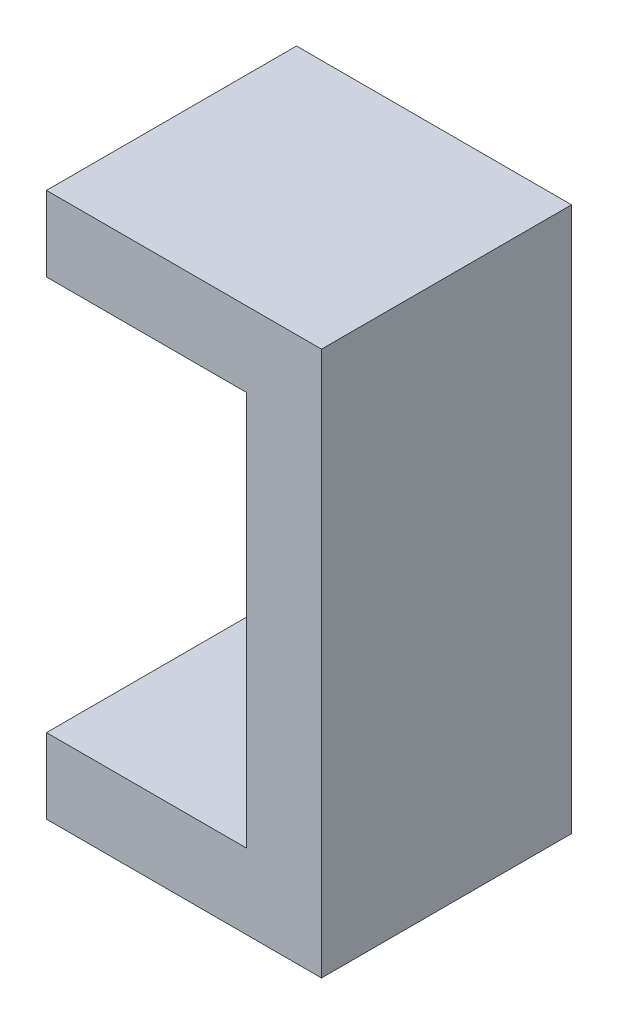
ISO-10303-21;
HEADER;
FILE_DESCRIPTION(('STEP AP214'),'2;1');
FILE_NAME('part.step','',(''),(''),'','','');
FILE_SCHEMA(('AUTOMOTIVE_DESIGN { 1 0 10303 214 1 1 1 1 }'));
ENDSEC;
DATA;
#1=APPLICATION_CONTEXT('core data for automotive mechanical design processes');
#2=APPLICATION_PROTOCOL_DEFINITION('international standard','automotive_design',2000,#1);
#3=PRODUCT_CONTEXT('',#1,'mechanical');
#4=PRODUCT('Part','Part','',(#3));
#5=PRODUCT_RELATED_PRODUCT_CATEGORY('part','',(#4));
#6=PRODUCT_DEFINITION_FORMATION('','',#4);
#7=PRODUCT_DEFINITION_CONTEXT('part definition',#1,'design');
#8=PRODUCT_DEFINITION('design','',#6,#7);
#9=PRODUCT_DEFINITION_SHAPE('','',#8);
#10=(LENGTH_UNIT() NAMED_UNIT(*) SI_UNIT(.MILLI.,.METRE.));
#11=(NAMED_UNIT(*) PLANE_ANGLE_UNIT() SI_UNIT($,.RADIAN.));
#12=(NAMED_UNIT(*) SI_UNIT($,.STERADIAN.) SOLID_ANGLE_UNIT());
#13=UNCERTAINTY_MEASURE_WITH_UNIT(LENGTH_MEASURE(1.E-05),#10,'distance_accuracy_value','');
#14=(GEOMETRIC_REPRESENTATION_CONTEXT(3) GLOBAL_UNCERTAINTY_ASSIGNED_CONTEXT((#13)) GLOBAL_UNIT_ASSIGNED_CONTEXT((#10,
#11,#12)) REPRESENTATION_CONTEXT('',''));
#15=CARTESIAN_POINT('',(0.,0.,0.));
#16=DIRECTION('',(0.,0.,1.));
#17=DIRECTION('',(1.,0.,0.));
#18=AXIS2_PLACEMENT_3D('',#15,#16,#17);
#19=CARTESIAN_POINT('',(-13.6553514130531,2.508,-13.4290792225759));
#20=DIRECTION('',(0.,1.,0.));
#21=DIRECTION('',(0.,0.,1.));
#22=AXIS2_PLACEMENT_3D('',#19,#20,#21);
#23=PLANE('',#22);
#24=DIRECTION('',(0.,0.,1.));
#25=VECTOR('',#24,1.);
#26=CARTESIAN_POINT('',(0.,2.508,-3.26907922257588));
#27=LINE('',#26,#25);
#28=CARTESIAN_POINT('',(0.,2.508,-13.4290792225759));
#29=VERTEX_POINT('',#28);
#30=CARTESIAN_POINT('',(0.,2.508,-3.26907922257588));
#31=VERTEX_POINT('',#30);
#32=EDGE_CURVE('E50',#29,#31,#27,.T.);
#33=ORIENTED_EDGE('',*,*,#32,.F.);
#34=DIRECTION('',(1.,0.,0.));
#35=VECTOR('',#34,1.);
#36=CARTESIAN_POINT('',(-13.6553514130531,2.508,-13.4290792225759));
#37=LINE('',#36,#35);
#38=CARTESIAN_POINT('',(5.08,2.508,-13.4290792225759));
#39=VERTEX_POINT('',#38);
#40=EDGE_CURVE('E123',#29,#39,#37,.T.);
#41=ORIENTED_EDGE('',*,*,#40,.T.);
#42=DIRECTION('',(0.,0.,1.));
#43=VECTOR('',#42,1.);
#44=CARTESIAN_POINT('',(5.08,2.508,-13.4290792225759));
#45=LINE('',#44,#43);
#46=CARTESIAN_POINT('',(5.08,2.508,-3.26907922257588));
#47=VERTEX_POINT('',#46);
#48=EDGE_CURVE('E147',#39,#47,#45,.T.);
#49=ORIENTED_EDGE('',*,*,#48,.T.);
#50=DIRECTION('',(1.,0.,0.));
#51=VECTOR('',#50,1.);
#52=CARTESIAN_POINT('',(-13.6553514130531,2.508,-3.26907922257588));
#53=LINE('',#52,#51);
#54=EDGE_CURVE('E55',#31,#47,#53,.T.);
#55=ORIENTED_EDGE('',*,*,#54,.F.);
#56=EDGE_LOOP('',(#33,#41,#49,#55));
#57=FACE_BOUND('',#56,.T.);
#58=ADVANCED_FACE('F35',(#57),#23,.F.);
#59=CARTESIAN_POINT('',(5.08,19.7193514130531,-3.26907922257588));
#60=DIRECTION('',(1.,0.,0.));
#61=DIRECTION('',(0.,0.,-1.));
#62=AXIS2_PLACEMENT_3D('',#59,#60,#61);
#63=PLANE('',#62);
#64=ORIENTED_EDGE('',*,*,#48,.F.);
#65=DIRECTION('',(0.,-1.,0.));
#66=VECTOR('',#65,1.);
#67=CARTESIAN_POINT('',(5.08,19.7193514130531,-13.4290792225759));
#68=LINE('',#67,#66);
#69=CARTESIAN_POINT('',(5.08,-13.5255,-13.4290792225759));
#70=VERTEX_POINT('',#69);
#71=EDGE_CURVE('E138',#39,#70,#68,.T.);
#72=ORIENTED_EDGE('',*,*,#71,.T.);
#73=DIRECTION('',(0.,0.,1.));
#74=VECTOR('',#73,1.);
#75=CARTESIAN_POINT('',(5.08,-13.5255,-3.26907922257588));
#76=LINE('',#75,#74);
#77=CARTESIAN_POINT('',(5.08,-13.5255,-3.26907922257588));
#78=VERTEX_POINT('',#77);
#79=EDGE_CURVE('E163',#70,#78,#76,.T.);
#80=ORIENTED_EDGE('',*,*,#79,.T.);
#81=DIRECTION('',(0.,-1.,0.));
#82=VECTOR('',#81,1.);
#83=CARTESIAN_POINT('',(5.08,19.7193514130531,-3.26907922257588));
#84=LINE('',#83,#82);
#85=EDGE_CURVE('E166',#47,#78,#84,.T.);
#86=ORIENTED_EDGE('',*,*,#85,.F.);
#87=EDGE_LOOP('',(#64,#72,#80,#86));
#88=FACE_BOUND('',#87,.T.);
#89=ADVANCED_FACE('F231',(#88),#63,.F.);
#90=CARTESIAN_POINT('',(8.128,-16.5735,-3.26907922257588));
#91=DIRECTION('',(-1.,0.,0.));
#92=DIRECTION('',(0.,0.,1.));
#93=AXIS2_PLACEMENT_3D('',#90,#91,#92);
#94=PLANE('',#93);
#95=DIRECTION('',(0.,1.,0.));
#96=VECTOR('',#95,1.);
#97=CARTESIAN_POINT('',(8.128,-16.5735,-13.4290792225759));
#98=LINE('',#97,#96);
#99=CARTESIAN_POINT('',(8.128,-16.5735,-13.4290792225759));
#100=VERTEX_POINT('',#99);
#101=CARTESIAN_POINT('',(8.128,5.556,-13.4290792225759));
#102=VERTEX_POINT('',#101);
#103=EDGE_CURVE('E188',#100,#102,#98,.T.);
#104=ORIENTED_EDGE('',*,*,#103,.T.);
#105=DIRECTION('',(0.,0.,-1.));
#106=VECTOR('',#105,1.);
#107=CARTESIAN_POINT('',(8.128,5.556,-3.26907922257588));
#108=LINE('',#107,#106);
#109=CARTESIAN_POINT('',(8.128,5.556,-3.26907922257588));
#110=VERTEX_POINT('',#109);
#111=EDGE_CURVE('E170',#110,#102,#108,.T.);
#112=ORIENTED_EDGE('',*,*,#111,.F.);
#113=DIRECTION('',(0.,1.,0.));
#114=VECTOR('',#113,1.);
#115=CARTESIAN_POINT('',(8.128,-16.5735,-3.26907922257588));
#116=LINE('',#115,#114);
#117=CARTESIAN_POINT('',(8.128,-16.5735,-3.26907922257588));
#118=VERTEX_POINT('',#117);
#119=EDGE_CURVE('E11',#118,#110,#116,.T.);
#120=ORIENTED_EDGE('',*,*,#119,.F.);
#121=DIRECTION('',(0.,0.,1.));
#122=VECTOR('',#121,1.);
#123=CARTESIAN_POINT('',(8.128,-16.5735,-3.26907922257588));
#124=LINE('',#123,#122);
#125=EDGE_CURVE('E178',#100,#118,#124,.T.);
#126=ORIENTED_EDGE('',*,*,#125,.F.);
#127=EDGE_LOOP('',(#104,#112,#120,#126));
#128=FACE_BOUND('',#127,.T.);
#129=ADVANCED_FACE('F37',(#128),#94,.F.);
#130=CARTESIAN_POINT('',(8.128,-16.5735,-3.26907922257588));
#131=DIRECTION('',(0.,0.,-1.));
#132=DIRECTION('',(-1.,0.,0.));
#133=AXIS2_PLACEMENT_3D('',#130,#131,#132);
#134=PLANE('',#133);
#135=ORIENTED_EDGE('',*,*,#119,.T.);
#136=DIRECTION('',(1.,0.,0.));
#137=VECTOR('',#136,1.);
#138=CARTESIAN_POINT('',(8.128,5.556,-3.26907922257588));
#139=LINE('',#138,#137);
#140=CARTESIAN_POINT('',(-3.048,5.556,-3.26907922257588));
#141=VERTEX_POINT('',#140);
#142=EDGE_CURVE('E173',#141,#110,#139,.T.);
#143=ORIENTED_EDGE('',*,*,#142,.F.);
#144=DIRECTION('',(0.,-1.,0.));
#145=VECTOR('',#144,1.);
#146=CARTESIAN_POINT('',(-3.048,5.556,-3.26907922257588));
#147=LINE('',#146,#145);
#148=CARTESIAN_POINT('',(-3.048,2.508,-3.26907922257588));
#149=VERTEX_POINT('',#148);
#150=EDGE_CURVE('E154',#141,#149,#147,.T.);
#151=ORIENTED_EDGE('',*,*,#150,.T.);
#152=EDGE_CURVE('E160',#149,#31,#53,.T.);
#153=ORIENTED_EDGE('',*,*,#152,.T.);
#154=ORIENTED_EDGE('',*,*,#54,.T.);
#155=ORIENTED_EDGE('',*,*,#85,.T.);
#156=DIRECTION('',(-1.,0.,0.));
#157=VECTOR('',#156,1.);
#158=CARTESIAN_POINT('',(8.128,-13.5255,-3.26907922257588));
#159=LINE('',#158,#157);
#160=CARTESIAN_POINT('',(-3.048,-13.5255,-3.26907922257588));
#161=VERTEX_POINT('',#160);
#162=EDGE_CURVE('E169',#78,#161,#159,.T.);
#163=ORIENTED_EDGE('',*,*,#162,.T.);
#164=DIRECTION('',(0.,1.,0.));
#165=VECTOR('',#164,1.);
#166=CARTESIAN_POINT('',(-3.048,-16.5735,-3.26907922257588));
#167=LINE('',#166,#165);
#168=CARTESIAN_POINT('',(-3.048,-16.5735,-3.26907922257588));
#169=VERTEX_POINT('',#168);
#170=EDGE_CURVE('E43',#169,#161,#167,.T.);
#171=ORIENTED_EDGE('',*,*,#170,.F.);
#172=DIRECTION('',(-1.,0.,0.));
#173=VECTOR('',#172,1.);
#174=CARTESIAN_POINT('',(8.128,-16.5735,-3.26907922257588));
#175=LINE('',#174,#173);
#176=EDGE_CURVE('E181',#118,#169,#175,.T.);
#177=ORIENTED_EDGE('',*,*,#176,.F.);
#178=EDGE_LOOP('',(#135,#143,#151,#153,#154,#155,#163,#171,#177));
#179=FACE_BOUND('',#178,.T.);
#180=ADVANCED_FACE('F215',(#179),#134,.F.);
#181=CARTESIAN_POINT('',(-3.048,-16.5735,-3.26907922257588));
#182=DIRECTION('',(1.,0.,0.));
#183=DIRECTION('',(0.,0.,-1.));
#184=AXIS2_PLACEMENT_3D('',#181,#182,#183);
#185=PLANE('',#184);
#186=DIRECTION('',(0.,0.,-1.));
#187=VECTOR('',#186,1.);
#188=CARTESIAN_POINT('',(-3.048,-13.5255,-3.26907922257588));
#189=LINE('',#188,#187);
#190=CARTESIAN_POINT('',(-3.048,-13.5255,-13.4290792225759));
#191=VERTEX_POINT('',#190);
#192=EDGE_CURVE('E190',#161,#191,#189,.T.);
#193=ORIENTED_EDGE('',*,*,#192,.T.);
#194=DIRECTION('',(0.,1.,0.));
#195=VECTOR('',#194,1.);
#196=CARTESIAN_POINT('',(-3.048,-16.5735,-13.4290792225759));
#197=LINE('',#196,#195);
#198=CARTESIAN_POINT('',(-3.048,-16.5735,-13.4290792225759));
#199=VERTEX_POINT('',#198);
#200=EDGE_CURVE('E194',#199,#191,#197,.T.);
#201=ORIENTED_EDGE('',*,*,#200,.F.);
#202=DIRECTION('',(0.,0.,-1.));
#203=VECTOR('',#202,1.);
#204=CARTESIAN_POINT('',(-3.048,-16.5735,-3.26907922257588));
#205=LINE('',#204,#203);
#206=EDGE_CURVE('E184',#169,#199,#205,.T.);
#207=ORIENTED_EDGE('',*,*,#206,.F.);
#208=ORIENTED_EDGE('',*,*,#170,.T.);
#209=EDGE_LOOP('',(#193,#201,#207,#208));
#210=FACE_BOUND('',#209,.T.);
#211=ADVANCED_FACE('F201',(#210),#185,.F.);
#212=CARTESIAN_POINT('',(8.128,-16.5735,-13.4290792225759));
#213=DIRECTION('',(0.,0.,1.));
#214=DIRECTION('',(1.,0.,0.));
#215=AXIS2_PLACEMENT_3D('',#212,#213,#214);
#216=PLANE('',#215);
#217=DIRECTION('',(1.,0.,0.));
#218=VECTOR('',#217,1.);
#219=CARTESIAN_POINT('',(8.128,-13.5255,-13.4290792225759));
#220=LINE('',#219,#218);
#221=EDGE_CURVE('E182',#191,#70,#220,.T.);
#222=ORIENTED_EDGE('',*,*,#221,.T.);
#223=ORIENTED_EDGE('',*,*,#71,.F.);
#224=ORIENTED_EDGE('',*,*,#40,.F.);
#225=CARTESIAN_POINT('',(-3.048,2.508,-13.4290792225759));
#226=VERTEX_POINT('',#225);
#227=EDGE_CURVE('E116',#226,#29,#37,.T.);
#228=ORIENTED_EDGE('',*,*,#227,.F.);
#229=DIRECTION('',(0.,1.,0.));
#230=VECTOR('',#229,1.);
#231=CARTESIAN_POINT('',(-3.048,5.556,-13.4290792225759));
#232=LINE('',#231,#230);
#233=CARTESIAN_POINT('',(-3.048,5.556,-13.4290792225759));
#234=VERTEX_POINT('',#233);
#235=EDGE_CURVE('E121',#226,#234,#232,.T.);
#236=ORIENTED_EDGE('',*,*,#235,.T.);
#237=DIRECTION('',(-1.,0.,0.));
#238=VECTOR('',#237,1.);
#239=CARTESIAN_POINT('',(8.128,5.556,-13.4290792225759));
#240=LINE('',#239,#238);
#241=EDGE_CURVE('E167',#102,#234,#240,.T.);
#242=ORIENTED_EDGE('',*,*,#241,.F.);
#243=ORIENTED_EDGE('',*,*,#103,.F.);
#244=DIRECTION('',(1.,0.,0.));
#245=VECTOR('',#244,1.);
#246=CARTESIAN_POINT('',(8.128,-16.5735,-13.4290792225759));
#247=LINE('',#246,#245);
#248=EDGE_CURVE('E186',#199,#100,#247,.T.);
#249=ORIENTED_EDGE('',*,*,#248,.F.);
#250=ORIENTED_EDGE('',*,*,#200,.T.);
#251=EDGE_LOOP('',(#222,#223,#224,#228,#236,#242,#243,#249,#250));
#252=FACE_BOUND('',#251,.T.);
#253=ADVANCED_FACE('F119',(#252),#216,.F.);
#254=CARTESIAN_POINT('',(0.,-16.5735,0.));
#255=DIRECTION('',(0.,1.,0.));
#256=DIRECTION('',(0.,0.,1.));
#257=AXIS2_PLACEMENT_3D('',#254,#255,#256);
#258=PLANE('',#257);
#259=ORIENTED_EDGE('',*,*,#125,.T.);
#260=ORIENTED_EDGE('',*,*,#176,.T.);
#261=ORIENTED_EDGE('',*,*,#206,.T.);
#262=ORIENTED_EDGE('',*,*,#248,.T.);
#263=EDGE_LOOP('',(#259,#260,#261,#262));
#264=FACE_BOUND('',#263,.T.);
#265=ADVANCED_FACE('F213',(#264),#258,.F.);
#266=CARTESIAN_POINT('',(0.,-13.5255,0.));
#267=DIRECTION('',(0.,1.,0.));
#268=DIRECTION('',(0.,0.,1.));
#269=AXIS2_PLACEMENT_3D('',#266,#267,#268);
#270=PLANE('',#269);
#271=ORIENTED_EDGE('',*,*,#79,.F.);
#272=ORIENTED_EDGE('',*,*,#221,.F.);
#273=ORIENTED_EDGE('',*,*,#192,.F.);
#274=ORIENTED_EDGE('',*,*,#162,.F.);
#275=EDGE_LOOP('',(#271,#272,#273,#274));
#276=FACE_BOUND('',#275,.T.);
#277=ADVANCED_FACE('F208',(#276),#270,.T.);
#278=CARTESIAN_POINT('',(0.,5.556,0.));
#279=DIRECTION('',(0.,1.,0.));
#280=DIRECTION('',(0.,0.,1.));
#281=AXIS2_PLACEMENT_3D('',#278,#279,#280);
#282=PLANE('',#281);
#283=ORIENTED_EDGE('',*,*,#142,.T.);
#284=ORIENTED_EDGE('',*,*,#111,.T.);
#285=ORIENTED_EDGE('',*,*,#241,.T.);
#286=DIRECTION('',(0.,0.,1.));
#287=VECTOR('',#286,1.);
#288=CARTESIAN_POINT('',(-3.048,5.556,-13.4290792225759));
#289=LINE('',#288,#287);
#290=EDGE_CURVE('E128',#234,#141,#289,.T.);
#291=ORIENTED_EDGE('',*,*,#290,.T.);
#292=EDGE_LOOP('',(#283,#284,#285,#291));
#293=FACE_BOUND('',#292,.T.);
#294=ADVANCED_FACE('F219',(#293),#282,.T.);
#295=CARTESIAN_POINT('',(-3.048,-16.5735,-3.26907922257588));
#296=DIRECTION('',(1.,0.,0.));
#297=DIRECTION('',(0.,0.,-1.));
#298=AXIS2_PLACEMENT_3D('',#295,#296,#297);
#299=PLANE('',#298);
#300=DIRECTION('',(0.,0.,-1.));
#301=VECTOR('',#300,1.);
#302=CARTESIAN_POINT('',(-3.048,2.508,-13.4290792225759));
#303=LINE('',#302,#301);
#304=EDGE_CURVE('E135',#149,#226,#303,.T.);
#305=ORIENTED_EDGE('',*,*,#304,.F.);
#306=ORIENTED_EDGE('',*,*,#150,.F.);
#307=ORIENTED_EDGE('',*,*,#290,.F.);
#308=ORIENTED_EDGE('',*,*,#235,.F.);
#309=EDGE_LOOP('',(#305,#306,#307,#308));
#310=FACE_BOUND('',#309,.T.);
#311=ADVANCED_FACE('F132',(#310),#299,.F.);
#312=CARTESIAN_POINT('',(-3.048,2.508,-3.26907922257588));
#313=DIRECTION('',(-0.707106781186546,-0.707106781186549,0.));
#314=DIRECTION('',(0.707106781186549,-0.707106781186546,0.));
#315=AXIS2_PLACEMENT_3D('',#312,#313,#314);
#316=PLANE('',#315);
#317=ORIENTED_EDGE('',*,*,#304,.T.);
#318=DIRECTION('',(-0.577350269189626,0.577350269189624,-0.577350269189627));
#319=VECTOR('',#318,1.);
#320=CARTESIAN_POINT('',(-3.048,2.508,-13.4290792225759));
#321=LINE('',#320,#319);
#322=CARTESIAN_POINT('',(-1.77799999999999,1.238,-12.1590792225759));
#323=VERTEX_POINT('',#322);
#324=EDGE_CURVE('E141',#323,#226,#321,.T.);
#325=ORIENTED_EDGE('',*,*,#324,.F.);
#326=DIRECTION('',(0.,0.,1.));
#327=VECTOR('',#326,1.);
#328=CARTESIAN_POINT('',(-1.77799999999999,1.238,-3.26907922257588));
#329=LINE('',#328,#327);
#330=CARTESIAN_POINT('',(-1.77799999999999,1.238,-4.53907922257589));
#331=VERTEX_POINT('',#330);
#332=EDGE_CURVE('E255',#331,#323,#329,.F.);
#333=ORIENTED_EDGE('',*,*,#332,.F.);
#334=DIRECTION('',(-0.577350269189627,0.577350269189624,0.577350269189627));
#335=VECTOR('',#334,1.);
#336=CARTESIAN_POINT('',(-3.048,2.508,-3.26907922257588));
#337=LINE('',#336,#335);
#338=EDGE_CURVE('E153',#331,#149,#337,.T.);
#339=ORIENTED_EDGE('',*,*,#338,.T.);
#340=EDGE_LOOP('',(#317,#325,#333,#339));
#341=FACE_BOUND('',#340,.T.);
#342=ADVANCED_FACE('F151',(#341),#316,.T.);
#343=CARTESIAN_POINT('',(-3.048,2.508,-13.4290792225759));
#344=DIRECTION('',(0.,-0.707106781186549,-0.707106781186546));
#345=DIRECTION('',(0.,0.707106781186546,-0.707106781186549));
#346=AXIS2_PLACEMENT_3D('',#343,#344,#345);
#347=PLANE('',#346);
#348=ORIENTED_EDGE('',*,*,#227,.T.);
#349=DIRECTION('',(0.577350269189627,0.577350269189624,-0.577350269189627));
#350=VECTOR('',#349,1.);
#351=CARTESIAN_POINT('',(-3.38666666666668,-0.878666666666663,-10.0424125559092));
#352=LINE('',#351,#350);
#353=CARTESIAN_POINT('',(-1.27,1.238,-12.1590792225759));
#354=VERTEX_POINT('',#353);
#355=EDGE_CURVE('E148',#354,#29,#352,.T.);
#356=ORIENTED_EDGE('',*,*,#355,.F.);
#357=DIRECTION('',(-1.,0.,0.));
#358=VECTOR('',#357,1.);
#359=CARTESIAN_POINT('',(-3.048,1.238,-12.1590792225759));
#360=LINE('',#359,#358);
#361=EDGE_CURVE('E143',#323,#354,#360,.F.);
#362=ORIENTED_EDGE('',*,*,#361,.F.);
#363=ORIENTED_EDGE('',*,*,#324,.T.);
#364=EDGE_LOOP('',(#348,#356,#362,#363));
#365=FACE_BOUND('',#364,.T.);
#366=ADVANCED_FACE('F142',(#365),#347,.T.);
#367=CARTESIAN_POINT('',(0.,2.508,-3.26907922257588));
#368=DIRECTION('',(0.707106781186546,-0.707106781186549,0.));
#369=DIRECTION('',(0.707106781186549,0.707106781186546,0.));
#370=AXIS2_PLACEMENT_3D('',#367,#368,#369);
#371=PLANE('',#370);
#372=ORIENTED_EDGE('',*,*,#32,.T.);
#373=DIRECTION('',(0.577350269189626,0.577350269189624,0.577350269189626));
#374=VECTOR('',#373,1.);
#375=CARTESIAN_POINT('',(-1.016,1.492,-4.28507922257589));
#376=LINE('',#375,#374);
#377=CARTESIAN_POINT('',(-1.27,1.238,-4.53907922257589));
#378=VERTEX_POINT('',#377);
#379=EDGE_CURVE('E265',#378,#31,#376,.T.);
#380=ORIENTED_EDGE('',*,*,#379,.F.);
#381=DIRECTION('',(0.,0.,-1.));
#382=VECTOR('',#381,1.);
#383=CARTESIAN_POINT('',(-1.27,1.238,-3.26907922257588));
#384=LINE('',#383,#382);
#385=EDGE_CURVE('E259',#354,#378,#384,.F.);
#386=ORIENTED_EDGE('',*,*,#385,.F.);
#387=ORIENTED_EDGE('',*,*,#355,.T.);
#388=EDGE_LOOP('',(#372,#380,#386,#387));
#389=FACE_BOUND('',#388,.T.);
#390=ADVANCED_FACE('F240',(#389),#371,.T.);
#391=CARTESIAN_POINT('',(-3.048,2.508,-3.26907922257588));
#392=DIRECTION('',(0.,-0.707106781186549,0.707106781186546));
#393=DIRECTION('',(0.,-0.707106781186546,-0.707106781186549));
#394=AXIS2_PLACEMENT_3D('',#391,#392,#393);
#395=PLANE('',#394);
#396=ORIENTED_EDGE('',*,*,#152,.F.);
#397=ORIENTED_EDGE('',*,*,#338,.F.);
#398=DIRECTION('',(1.,0.,0.));
#399=VECTOR('',#398,1.);
#400=CARTESIAN_POINT('',(-3.048,1.238,-4.53907922257589));
#401=LINE('',#400,#399);
#402=EDGE_CURVE('E257',#378,#331,#401,.F.);
#403=ORIENTED_EDGE('',*,*,#402,.F.);
#404=ORIENTED_EDGE('',*,*,#379,.T.);
#405=EDGE_LOOP('',(#396,#397,#403,#404));
#406=FACE_BOUND('',#405,.T.);
#407=ADVANCED_FACE('F243',(#406),#395,.T.);
#408=CARTESIAN_POINT('',(0.,1.238,0.));
#409=DIRECTION('',(0.,-1.,0.));
#410=DIRECTION('',(0.,0.,-1.));
#411=AXIS2_PLACEMENT_3D('',#408,#409,#410);
#412=PLANE('',#411);
#413=ORIENTED_EDGE('',*,*,#332,.T.);
#414=ORIENTED_EDGE('',*,*,#361,.T.);
#415=ORIENTED_EDGE('',*,*,#385,.T.);
#416=ORIENTED_EDGE('',*,*,#402,.T.);
#417=EDGE_LOOP('',(#413,#414,#415,#416));
#418=FACE_BOUND('',#417,.T.);
#419=ADVANCED_FACE('F247',(#418),#412,.T.);
#420=CLOSED_SHELL('',(#58,#89,#129,#180,#211,#253,#265,#277,#294,#311,#342,#366,#390,#407,#419));
#421=MANIFOLD_SOLID_BREP('B2',#420);
#422=ADVANCED_BREP_SHAPE_REPRESENTATION('',(#18,#421),#14);
#423=SHAPE_DEFINITION_REPRESENTATION(#9,#422);
ENDSEC;
END-ISO-10303-21;
